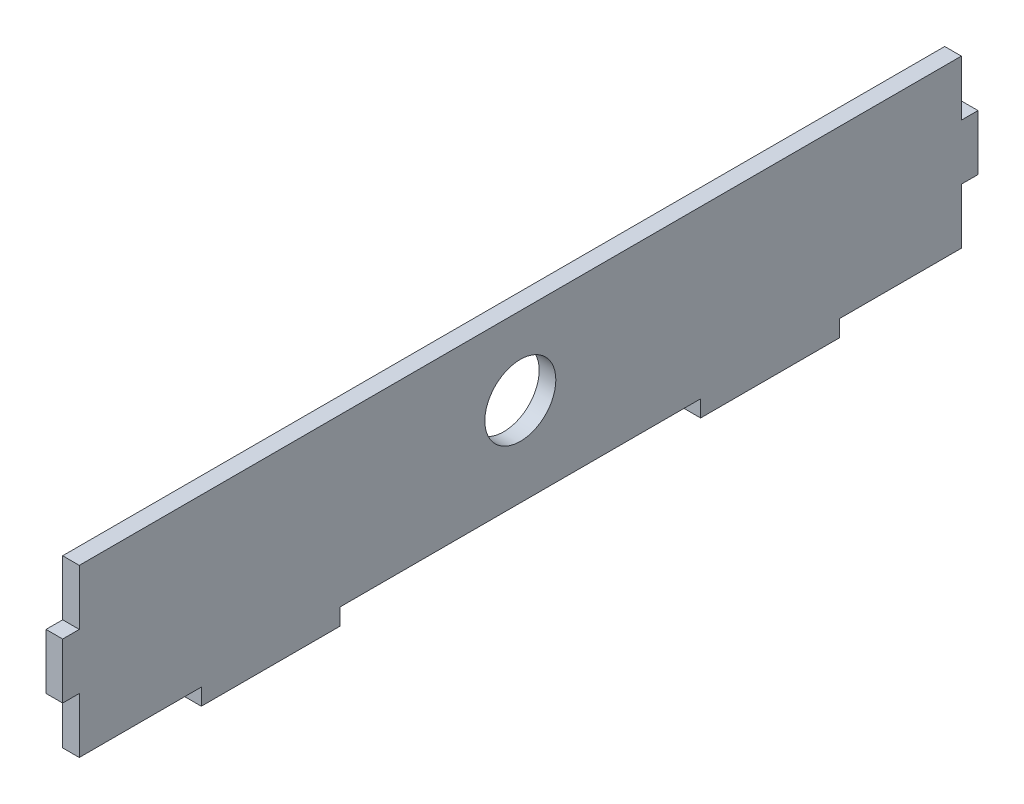
ISO-10303-21;
HEADER;
FILE_DESCRIPTION(('STEP AP214'),'2;1');
FILE_NAME('part.step','',(''),(''),'','','');
FILE_SCHEMA(('AUTOMOTIVE_DESIGN { 1 0 10303 214 1 1 1 1 }'));
ENDSEC;
DATA;
#1=APPLICATION_CONTEXT('core data for automotive mechanical design processes');
#2=APPLICATION_PROTOCOL_DEFINITION('international standard','automotive_design',2000,#1);
#3=PRODUCT_CONTEXT('',#1,'mechanical');
#4=PRODUCT('Part','Part','',(#3));
#5=PRODUCT_RELATED_PRODUCT_CATEGORY('part','',(#4));
#6=PRODUCT_DEFINITION_FORMATION('','',#4);
#7=PRODUCT_DEFINITION_CONTEXT('part definition',#1,'design');
#8=PRODUCT_DEFINITION('design','',#6,#7);
#9=PRODUCT_DEFINITION_SHAPE('','',#8);
#10=(LENGTH_UNIT() NAMED_UNIT(*) SI_UNIT(.MILLI.,.METRE.));
#11=(NAMED_UNIT(*) PLANE_ANGLE_UNIT() SI_UNIT($,.RADIAN.));
#12=(NAMED_UNIT(*) SI_UNIT($,.STERADIAN.) SOLID_ANGLE_UNIT());
#13=UNCERTAINTY_MEASURE_WITH_UNIT(LENGTH_MEASURE(1.E-05),#10,'distance_accuracy_value','');
#14=(GEOMETRIC_REPRESENTATION_CONTEXT(3) GLOBAL_UNCERTAINTY_ASSIGNED_CONTEXT((#13)) GLOBAL_UNIT_ASSIGNED_CONTEXT((#10,
#11,#12)) REPRESENTATION_CONTEXT('',''));
#15=CARTESIAN_POINT('',(0.,0.,0.));
#16=DIRECTION('',(0.,0.,1.));
#17=DIRECTION('',(1.,0.,0.));
#18=AXIS2_PLACEMENT_3D('',#15,#16,#17);
#19=CARTESIAN_POINT('',(3.,0.,0.));
#20=DIRECTION('',(1.,0.,0.));
#21=DIRECTION('',(0.,0.,-1.));
#22=AXIS2_PLACEMENT_3D('',#19,#20,#21);
#23=PLANE('',#22);
#24=DIRECTION('',(0.,-1.,0.));
#25=VECTOR('',#24,1.);
#26=CARTESIAN_POINT('',(3.,5.00000000000001,79.5));
#27=LINE('',#26,#25);
#28=CARTESIAN_POINT('',(3.,15.,79.5));
#29=VERTEX_POINT('',#28);
#30=CARTESIAN_POINT('',(3.,5.00000000000001,79.5));
#31=VERTEX_POINT('',#30);
#32=EDGE_CURVE('E241',#29,#31,#27,.T.);
#33=ORIENTED_EDGE('',*,*,#32,.T.);
#34=DIRECTION('',(0.,0.,1.));
#35=VECTOR('',#34,1.);
#36=CARTESIAN_POINT('',(3.,5.00000000000001,79.5));
#37=LINE('',#36,#35);
#38=CARTESIAN_POINT('',(3.,4.99999999999999,82.5));
#39=VERTEX_POINT('',#38);
#40=EDGE_CURVE('E129',#31,#39,#37,.T.);
#41=ORIENTED_EDGE('',*,*,#40,.T.);
#42=DIRECTION('',(0.,-1.,0.));
#43=VECTOR('',#42,1.);
#44=CARTESIAN_POINT('',(3.,4.99999999999999,82.5));
#45=LINE('',#44,#43);
#46=CARTESIAN_POINT('',(3.,-5.00000000000001,82.5));
#47=VERTEX_POINT('',#46);
#48=EDGE_CURVE('E292',#39,#47,#45,.T.);
#49=ORIENTED_EDGE('',*,*,#48,.T.);
#50=DIRECTION('',(0.,0.,-1.));
#51=VECTOR('',#50,1.);
#52=CARTESIAN_POINT('',(3.,-4.99999999999999,79.5));
#53=LINE('',#52,#51);
#54=CARTESIAN_POINT('',(3.,-4.99999999999999,79.5));
#55=VERTEX_POINT('',#54);
#56=EDGE_CURVE('E311',#47,#55,#53,.T.);
#57=ORIENTED_EDGE('',*,*,#56,.T.);
#58=DIRECTION('',(0.,-1.,0.));
#59=VECTOR('',#58,1.);
#60=CARTESIAN_POINT('',(3.,-15.,79.5));
#61=LINE('',#60,#59);
#62=CARTESIAN_POINT('',(3.,-15.,79.5));
#63=VERTEX_POINT('',#62);
#64=EDGE_CURVE('E308',#55,#63,#61,.T.);
#65=ORIENTED_EDGE('',*,*,#64,.T.);
#66=DIRECTION('',(0.,0.,-1.));
#67=VECTOR('',#66,1.);
#68=CARTESIAN_POINT('',(3.,-15.,57.5));
#69=LINE('',#68,#67);
#70=CARTESIAN_POINT('',(3.,-15.,57.5));
#71=VERTEX_POINT('',#70);
#72=EDGE_CURVE('E310',#63,#71,#69,.T.);
#73=ORIENTED_EDGE('',*,*,#72,.T.);
#74=DIRECTION('',(0.,-1.,0.));
#75=VECTOR('',#74,1.);
#76=CARTESIAN_POINT('',(3.,-15.,57.5));
#77=LINE('',#76,#75);
#78=CARTESIAN_POINT('',(3.,-18.,57.5));
#79=VERTEX_POINT('',#78);
#80=EDGE_CURVE('E313',#71,#79,#77,.T.);
#81=ORIENTED_EDGE('',*,*,#80,.T.);
#82=DIRECTION('',(0.,0.,-1.));
#83=VECTOR('',#82,1.);
#84=CARTESIAN_POINT('',(3.,-18.,57.5));
#85=LINE('',#84,#83);
#86=CARTESIAN_POINT('',(3.,-18.,32.5));
#87=VERTEX_POINT('',#86);
#88=EDGE_CURVE('E319',#79,#87,#85,.T.);
#89=ORIENTED_EDGE('',*,*,#88,.T.);
#90=DIRECTION('',(0.,1.,0.));
#91=VECTOR('',#90,1.);
#92=CARTESIAN_POINT('',(3.,-15.,32.5));
#93=LINE('',#92,#91);
#94=CARTESIAN_POINT('',(3.,-15.,32.5));
#95=VERTEX_POINT('',#94);
#96=EDGE_CURVE('E321',#87,#95,#93,.T.);
#97=ORIENTED_EDGE('',*,*,#96,.T.);
#98=DIRECTION('',(0.,0.,-1.));
#99=VECTOR('',#98,1.);
#100=CARTESIAN_POINT('',(3.,-15.,-32.5));
#101=LINE('',#100,#99);
#102=CARTESIAN_POINT('',(3.,-15.,-32.5));
#103=VERTEX_POINT('',#102);
#104=EDGE_CURVE('E323',#95,#103,#101,.T.);
#105=ORIENTED_EDGE('',*,*,#104,.T.);
#106=DIRECTION('',(0.,-1.,0.));
#107=VECTOR('',#106,1.);
#108=CARTESIAN_POINT('',(3.,-15.,-32.5));
#109=LINE('',#108,#107);
#110=CARTESIAN_POINT('',(3.,-18.,-32.5));
#111=VERTEX_POINT('',#110);
#112=EDGE_CURVE('E325',#103,#111,#109,.T.);
#113=ORIENTED_EDGE('',*,*,#112,.T.);
#114=DIRECTION('',(0.,0.,-1.));
#115=VECTOR('',#114,1.);
#116=CARTESIAN_POINT('',(3.,-18.,-32.5));
#117=LINE('',#116,#115);
#118=CARTESIAN_POINT('',(3.,-18.,-57.5));
#119=VERTEX_POINT('',#118);
#120=EDGE_CURVE('E327',#111,#119,#117,.T.);
#121=ORIENTED_EDGE('',*,*,#120,.T.);
#122=DIRECTION('',(0.,1.,0.));
#123=VECTOR('',#122,1.);
#124=CARTESIAN_POINT('',(3.,-15.,-57.5));
#125=LINE('',#124,#123);
#126=CARTESIAN_POINT('',(3.,-15.,-57.5));
#127=VERTEX_POINT('',#126);
#128=EDGE_CURVE('E329',#119,#127,#125,.T.);
#129=ORIENTED_EDGE('',*,*,#128,.T.);
#130=DIRECTION('',(0.,0.,-1.));
#131=VECTOR('',#130,1.);
#132=CARTESIAN_POINT('',(3.,-15.,-79.5));
#133=LINE('',#132,#131);
#134=CARTESIAN_POINT('',(3.,-15.,-79.5));
#135=VERTEX_POINT('',#134);
#136=EDGE_CURVE('E331',#127,#135,#133,.T.);
#137=ORIENTED_EDGE('',*,*,#136,.T.);
#138=DIRECTION('',(0.,1.,0.));
#139=VECTOR('',#138,1.);
#140=CARTESIAN_POINT('',(3.,-15.,-79.5));
#141=LINE('',#140,#139);
#142=CARTESIAN_POINT('',(3.,-4.99999999999999,-79.5));
#143=VERTEX_POINT('',#142);
#144=EDGE_CURVE('E333',#135,#143,#141,.T.);
#145=ORIENTED_EDGE('',*,*,#144,.T.);
#146=DIRECTION('',(0.,0.,-1.));
#147=VECTOR('',#146,1.);
#148=CARTESIAN_POINT('',(3.,-4.99999999999999,-79.5));
#149=LINE('',#148,#147);
#150=CARTESIAN_POINT('',(3.,-4.99999999999999,-82.5));
#151=VERTEX_POINT('',#150);
#152=EDGE_CURVE('E335',#143,#151,#149,.T.);
#153=ORIENTED_EDGE('',*,*,#152,.T.);
#154=DIRECTION('',(0.,1.,0.));
#155=VECTOR('',#154,1.);
#156=CARTESIAN_POINT('',(3.,5.00000000000001,-82.5));
#157=LINE('',#156,#155);
#158=CARTESIAN_POINT('',(3.,5.00000000000001,-82.5));
#159=VERTEX_POINT('',#158);
#160=EDGE_CURVE('E184',#151,#159,#157,.T.);
#161=ORIENTED_EDGE('',*,*,#160,.T.);
#162=DIRECTION('',(0.,0.,1.));
#163=VECTOR('',#162,1.);
#164=CARTESIAN_POINT('',(3.,5.00000000000001,-79.5));
#165=LINE('',#164,#163);
#166=CARTESIAN_POINT('',(3.,5.00000000000001,-79.5));
#167=VERTEX_POINT('',#166);
#168=EDGE_CURVE('E178',#159,#167,#165,.T.);
#169=ORIENTED_EDGE('',*,*,#168,.T.);
#170=DIRECTION('',(0.,1.,0.));
#171=VECTOR('',#170,1.);
#172=CARTESIAN_POINT('',(3.,5.00000000000001,-79.5));
#173=LINE('',#172,#171);
#174=CARTESIAN_POINT('',(3.,15.,-79.5));
#175=VERTEX_POINT('',#174);
#176=EDGE_CURVE('E182',#167,#175,#173,.T.);
#177=ORIENTED_EDGE('',*,*,#176,.T.);
#178=DIRECTION('',(0.,0.,1.));
#179=VECTOR('',#178,1.);
#180=CARTESIAN_POINT('',(3.,15.,-79.5));
#181=LINE('',#180,#179);
#182=EDGE_CURVE('E50',#175,#29,#181,.T.);
#183=ORIENTED_EDGE('',*,*,#182,.T.);
#184=EDGE_LOOP('',(#33,#41,#49,#57,#65,#73,#81,#89,#97,#105,#113,#121,#129,#137,#145,#153,#161,
#169,#177,#183));
#185=FACE_BOUND('',#184,.T.);
#186=CARTESIAN_POINT('',(3.,0.999999999999998,0.));
#187=DIRECTION('',(1.,0.,0.));
#188=DIRECTION('',(0.,0.,-1.));
#189=AXIS2_PLACEMENT_3D('',#186,#187,#188);
#190=CIRCLE('',#189,6.4);
#191=CARTESIAN_POINT('',(3.,0.999999999999998,-6.4));
#192=VERTEX_POINT('',#191);
#193=EDGE_CURVE('E206',#192,#192,#190,.T.);
#194=ORIENTED_EDGE('',*,*,#193,.F.);
#195=EDGE_LOOP('',(#194));
#196=FACE_BOUND('',#195,.T.);
#197=ADVANCED_FACE('F33',(#185,#196),#23,.T.);
#198=CARTESIAN_POINT('',(0.,0.,0.));
#199=DIRECTION('',(1.,0.,0.));
#200=DIRECTION('',(0.,0.,-1.));
#201=AXIS2_PLACEMENT_3D('',#198,#199,#200);
#202=PLANE('',#201);
#203=DIRECTION('',(0.,-1.,0.));
#204=VECTOR('',#203,1.);
#205=CARTESIAN_POINT('',(0.,5.00000000000001,79.5));
#206=LINE('',#205,#204);
#207=CARTESIAN_POINT('',(0.,15.,79.5));
#208=VERTEX_POINT('',#207);
#209=CARTESIAN_POINT('',(0.,5.00000000000001,79.5));
#210=VERTEX_POINT('',#209);
#211=EDGE_CURVE('E202',#208,#210,#206,.T.);
#212=ORIENTED_EDGE('',*,*,#211,.F.);
#213=DIRECTION('',(0.,0.,1.));
#214=VECTOR('',#213,1.);
#215=CARTESIAN_POINT('',(0.,15.,-79.5));
#216=LINE('',#215,#214);
#217=CARTESIAN_POINT('',(0.,15.,-79.5));
#218=VERTEX_POINT('',#217);
#219=EDGE_CURVE('E121',#218,#208,#216,.T.);
#220=ORIENTED_EDGE('',*,*,#219,.F.);
#221=DIRECTION('',(0.,1.,0.));
#222=VECTOR('',#221,1.);
#223=CARTESIAN_POINT('',(0.,5.00000000000001,-79.5));
#224=LINE('',#223,#222);
#225=CARTESIAN_POINT('',(0.,5.00000000000001,-79.5));
#226=VERTEX_POINT('',#225);
#227=EDGE_CURVE('E115',#226,#218,#224,.T.);
#228=ORIENTED_EDGE('',*,*,#227,.F.);
#229=DIRECTION('',(0.,0.,1.));
#230=VECTOR('',#229,1.);
#231=CARTESIAN_POINT('',(0.,5.00000000000001,-79.5));
#232=LINE('',#231,#230);
#233=CARTESIAN_POINT('',(0.,5.00000000000001,-82.5));
#234=VERTEX_POINT('',#233);
#235=EDGE_CURVE('E192',#234,#226,#232,.T.);
#236=ORIENTED_EDGE('',*,*,#235,.F.);
#237=DIRECTION('',(0.,1.,0.));
#238=VECTOR('',#237,1.);
#239=CARTESIAN_POINT('',(0.,5.00000000000001,-82.5));
#240=LINE('',#239,#238);
#241=CARTESIAN_POINT('',(0.,-4.99999999999999,-82.5));
#242=VERTEX_POINT('',#241);
#243=EDGE_CURVE('E236',#242,#234,#240,.T.);
#244=ORIENTED_EDGE('',*,*,#243,.F.);
#245=DIRECTION('',(0.,0.,-1.));
#246=VECTOR('',#245,1.);
#247=CARTESIAN_POINT('',(0.,-4.99999999999999,-79.5));
#248=LINE('',#247,#246);
#249=CARTESIAN_POINT('',(0.,-4.99999999999999,-79.5));
#250=VERTEX_POINT('',#249);
#251=EDGE_CURVE('E234',#250,#242,#248,.T.);
#252=ORIENTED_EDGE('',*,*,#251,.F.);
#253=DIRECTION('',(0.,1.,0.));
#254=VECTOR('',#253,1.);
#255=CARTESIAN_POINT('',(0.,-15.,-79.5));
#256=LINE('',#255,#254);
#257=CARTESIAN_POINT('',(0.,-15.,-79.5));
#258=VERTEX_POINT('',#257);
#259=EDGE_CURVE('E232',#258,#250,#256,.T.);
#260=ORIENTED_EDGE('',*,*,#259,.F.);
#261=DIRECTION('',(0.,0.,-1.));
#262=VECTOR('',#261,1.);
#263=CARTESIAN_POINT('',(0.,-15.,-79.5));
#264=LINE('',#263,#262);
#265=CARTESIAN_POINT('',(0.,-15.,-57.5));
#266=VERTEX_POINT('',#265);
#267=EDGE_CURVE('E230',#266,#258,#264,.T.);
#268=ORIENTED_EDGE('',*,*,#267,.F.);
#269=DIRECTION('',(0.,1.,0.));
#270=VECTOR('',#269,1.);
#271=CARTESIAN_POINT('',(0.,-15.,-57.5));
#272=LINE('',#271,#270);
#273=CARTESIAN_POINT('',(0.,-18.,-57.5));
#274=VERTEX_POINT('',#273);
#275=EDGE_CURVE('E228',#274,#266,#272,.T.);
#276=ORIENTED_EDGE('',*,*,#275,.F.);
#277=DIRECTION('',(0.,0.,-1.));
#278=VECTOR('',#277,1.);
#279=CARTESIAN_POINT('',(0.,-18.,-32.5));
#280=LINE('',#279,#278);
#281=CARTESIAN_POINT('',(0.,-18.,-32.5));
#282=VERTEX_POINT('',#281);
#283=EDGE_CURVE('E226',#282,#274,#280,.T.);
#284=ORIENTED_EDGE('',*,*,#283,.F.);
#285=DIRECTION('',(0.,-1.,0.));
#286=VECTOR('',#285,1.);
#287=CARTESIAN_POINT('',(0.,-15.,-32.5));
#288=LINE('',#287,#286);
#289=CARTESIAN_POINT('',(0.,-15.,-32.5));
#290=VERTEX_POINT('',#289);
#291=EDGE_CURVE('E224',#290,#282,#288,.T.);
#292=ORIENTED_EDGE('',*,*,#291,.F.);
#293=DIRECTION('',(0.,0.,-1.));
#294=VECTOR('',#293,1.);
#295=CARTESIAN_POINT('',(0.,-15.,-32.5));
#296=LINE('',#295,#294);
#297=CARTESIAN_POINT('',(0.,-15.,32.5));
#298=VERTEX_POINT('',#297);
#299=EDGE_CURVE('E222',#298,#290,#296,.T.);
#300=ORIENTED_EDGE('',*,*,#299,.F.);
#301=DIRECTION('',(0.,1.,0.));
#302=VECTOR('',#301,1.);
#303=CARTESIAN_POINT('',(0.,-15.,32.5));
#304=LINE('',#303,#302);
#305=CARTESIAN_POINT('',(0.,-18.,32.5));
#306=VERTEX_POINT('',#305);
#307=EDGE_CURVE('E220',#306,#298,#304,.T.);
#308=ORIENTED_EDGE('',*,*,#307,.F.);
#309=DIRECTION('',(0.,0.,-1.));
#310=VECTOR('',#309,1.);
#311=CARTESIAN_POINT('',(0.,-18.,57.5));
#312=LINE('',#311,#310);
#313=CARTESIAN_POINT('',(0.,-18.,57.5));
#314=VERTEX_POINT('',#313);
#315=EDGE_CURVE('E218',#314,#306,#312,.T.);
#316=ORIENTED_EDGE('',*,*,#315,.F.);
#317=DIRECTION('',(0.,-1.,0.));
#318=VECTOR('',#317,1.);
#319=CARTESIAN_POINT('',(0.,-15.,57.5));
#320=LINE('',#319,#318);
#321=CARTESIAN_POINT('',(0.,-15.,57.5));
#322=VERTEX_POINT('',#321);
#323=EDGE_CURVE('E216',#322,#314,#320,.T.);
#324=ORIENTED_EDGE('',*,*,#323,.F.);
#325=DIRECTION('',(0.,0.,-1.));
#326=VECTOR('',#325,1.);
#327=CARTESIAN_POINT('',(0.,-15.,57.5));
#328=LINE('',#327,#326);
#329=CARTESIAN_POINT('',(0.,-15.,79.5));
#330=VERTEX_POINT('',#329);
#331=EDGE_CURVE('E214',#330,#322,#328,.T.);
#332=ORIENTED_EDGE('',*,*,#331,.F.);
#333=DIRECTION('',(0.,-1.,0.));
#334=VECTOR('',#333,1.);
#335=CARTESIAN_POINT('',(0.,-15.,79.5));
#336=LINE('',#335,#334);
#337=CARTESIAN_POINT('',(0.,-4.99999999999999,79.5));
#338=VERTEX_POINT('',#337);
#339=EDGE_CURVE('E212',#338,#330,#336,.T.);
#340=ORIENTED_EDGE('',*,*,#339,.F.);
#341=DIRECTION('',(0.,0.,-1.));
#342=VECTOR('',#341,1.);
#343=CARTESIAN_POINT('',(0.,-4.99999999999999,79.5));
#344=LINE('',#343,#342);
#345=CARTESIAN_POINT('',(0.,-5.00000000000001,82.5));
#346=VERTEX_POINT('',#345);
#347=EDGE_CURVE('E210',#346,#338,#344,.T.);
#348=ORIENTED_EDGE('',*,*,#347,.F.);
#349=DIRECTION('',(0.,-1.,0.));
#350=VECTOR('',#349,1.);
#351=CARTESIAN_POINT('',(0.,4.99999999999999,82.5));
#352=LINE('',#351,#350);
#353=CARTESIAN_POINT('',(0.,4.99999999999999,82.5));
#354=VERTEX_POINT('',#353);
#355=EDGE_CURVE('E208',#354,#346,#352,.T.);
#356=ORIENTED_EDGE('',*,*,#355,.F.);
#357=DIRECTION('',(0.,0.,1.));
#358=VECTOR('',#357,1.);
#359=CARTESIAN_POINT('',(0.,5.00000000000001,79.5));
#360=LINE('',#359,#358);
#361=EDGE_CURVE('E205',#210,#354,#360,.T.);
#362=ORIENTED_EDGE('',*,*,#361,.F.);
#363=EDGE_LOOP('',(#212,#220,#228,#236,#244,#252,#260,#268,#276,#284,#292,#300,#308,#316,#324,
#332,#340,#348,#356,#362));
#364=FACE_BOUND('',#363,.T.);
#365=CARTESIAN_POINT('',(0.,0.999999999999998,0.));
#366=DIRECTION('',(1.,0.,0.));
#367=DIRECTION('',(0.,0.,-1.));
#368=AXIS2_PLACEMENT_3D('',#365,#366,#367);
#369=CIRCLE('',#368,6.4);
#370=CARTESIAN_POINT('',(0.,0.999999999999998,-6.4));
#371=VERTEX_POINT('',#370);
#372=EDGE_CURVE('E586',#371,#371,#369,.T.);
#373=ORIENTED_EDGE('',*,*,#372,.T.);
#374=EDGE_LOOP('',(#373));
#375=FACE_BOUND('',#374,.T.);
#376=ADVANCED_FACE('F296',(#364,#375),#202,.F.);
#377=CARTESIAN_POINT('',(3.,5.00000000000001,79.5));
#378=DIRECTION('',(0.,0.,-1.));
#379=DIRECTION('',(-1.,0.,0.));
#380=AXIS2_PLACEMENT_3D('',#377,#378,#379);
#381=PLANE('',#380);
#382=ORIENTED_EDGE('',*,*,#211,.T.);
#383=DIRECTION('',(-1.,0.,0.));
#384=VECTOR('',#383,1.);
#385=CARTESIAN_POINT('',(3.,5.00000000000001,79.5));
#386=LINE('',#385,#384);
#387=EDGE_CURVE('E11',#31,#210,#386,.T.);
#388=ORIENTED_EDGE('',*,*,#387,.F.);
#389=ORIENTED_EDGE('',*,*,#32,.F.);
#390=DIRECTION('',(-1.,0.,0.));
#391=VECTOR('',#390,1.);
#392=CARTESIAN_POINT('',(3.,15.,79.5));
#393=LINE('',#392,#391);
#394=EDGE_CURVE('E198',#29,#208,#393,.T.);
#395=ORIENTED_EDGE('',*,*,#394,.T.);
#396=EDGE_LOOP('',(#382,#388,#389,#395));
#397=FACE_BOUND('',#396,.T.);
#398=ADVANCED_FACE('F35',(#397),#381,.F.);
#399=CARTESIAN_POINT('',(3.,5.00000000000001,79.5));
#400=DIRECTION('',(0.,-1.,0.));
#401=DIRECTION('',(0.,0.,-1.));
#402=AXIS2_PLACEMENT_3D('',#399,#400,#401);
#403=PLANE('',#402);
#404=ORIENTED_EDGE('',*,*,#361,.T.);
#405=DIRECTION('',(-1.,0.,0.));
#406=VECTOR('',#405,1.);
#407=CARTESIAN_POINT('',(3.,4.99999999999999,82.5));
#408=LINE('',#407,#406);
#409=EDGE_CURVE('E42',#39,#354,#408,.T.);
#410=ORIENTED_EDGE('',*,*,#409,.F.);
#411=ORIENTED_EDGE('',*,*,#40,.F.);
#412=ORIENTED_EDGE('',*,*,#387,.T.);
#413=EDGE_LOOP('',(#404,#410,#411,#412));
#414=FACE_BOUND('',#413,.T.);
#415=ADVANCED_FACE('F369',(#414),#403,.F.);
#416=CARTESIAN_POINT('',(3.,4.99999999999999,82.5));
#417=DIRECTION('',(0.,0.,-1.));
#418=DIRECTION('',(-1.,0.,0.));
#419=AXIS2_PLACEMENT_3D('',#416,#417,#418);
#420=PLANE('',#419);
#421=ORIENTED_EDGE('',*,*,#355,.T.);
#422=DIRECTION('',(-1.,0.,0.));
#423=VECTOR('',#422,1.);
#424=CARTESIAN_POINT('',(3.,-5.00000000000001,82.5));
#425=LINE('',#424,#423);
#426=EDGE_CURVE('E284',#47,#346,#425,.T.);
#427=ORIENTED_EDGE('',*,*,#426,.F.);
#428=ORIENTED_EDGE('',*,*,#48,.F.);
#429=ORIENTED_EDGE('',*,*,#409,.T.);
#430=EDGE_LOOP('',(#421,#427,#428,#429));
#431=FACE_BOUND('',#430,.T.);
#432=ADVANCED_FACE('F290',(#431),#420,.F.);
#433=CARTESIAN_POINT('',(3.,-4.99999999999999,79.5));
#434=DIRECTION('',(0.,1.,0.));
#435=DIRECTION('',(0.,0.,1.));
#436=AXIS2_PLACEMENT_3D('',#433,#434,#435);
#437=PLANE('',#436);
#438=ORIENTED_EDGE('',*,*,#347,.T.);
#439=DIRECTION('',(-1.,0.,0.));
#440=VECTOR('',#439,1.);
#441=CARTESIAN_POINT('',(3.,-4.99999999999999,79.5));
#442=LINE('',#441,#440);
#443=EDGE_CURVE('E281',#55,#338,#442,.T.);
#444=ORIENTED_EDGE('',*,*,#443,.F.);
#445=ORIENTED_EDGE('',*,*,#56,.F.);
#446=ORIENTED_EDGE('',*,*,#426,.T.);
#447=EDGE_LOOP('',(#438,#444,#445,#446));
#448=FACE_BOUND('',#447,.T.);
#449=ADVANCED_FACE('F302',(#448),#437,.F.);
#450=CARTESIAN_POINT('',(3.,-15.,79.5));
#451=DIRECTION('',(0.,0.,-1.));
#452=DIRECTION('',(-1.,0.,0.));
#453=AXIS2_PLACEMENT_3D('',#450,#451,#452);
#454=PLANE('',#453);
#455=ORIENTED_EDGE('',*,*,#339,.T.);
#456=DIRECTION('',(-1.,0.,0.));
#457=VECTOR('',#456,1.);
#458=CARTESIAN_POINT('',(3.,-15.,79.5));
#459=LINE('',#458,#457);
#460=EDGE_CURVE('E278',#63,#330,#459,.T.);
#461=ORIENTED_EDGE('',*,*,#460,.F.);
#462=ORIENTED_EDGE('',*,*,#64,.F.);
#463=ORIENTED_EDGE('',*,*,#443,.T.);
#464=EDGE_LOOP('',(#455,#461,#462,#463));
#465=FACE_BOUND('',#464,.T.);
#466=ADVANCED_FACE('F306',(#465),#454,.F.);
#467=CARTESIAN_POINT('',(3.,-15.,57.5));
#468=DIRECTION('',(0.,1.,0.));
#469=DIRECTION('',(0.,0.,1.));
#470=AXIS2_PLACEMENT_3D('',#467,#468,#469);
#471=PLANE('',#470);
#472=ORIENTED_EDGE('',*,*,#331,.T.);
#473=DIRECTION('',(-1.,0.,0.));
#474=VECTOR('',#473,1.);
#475=CARTESIAN_POINT('',(3.,-15.,57.5));
#476=LINE('',#475,#474);
#477=EDGE_CURVE('E275',#71,#322,#476,.T.);
#478=ORIENTED_EDGE('',*,*,#477,.F.);
#479=ORIENTED_EDGE('',*,*,#72,.F.);
#480=ORIENTED_EDGE('',*,*,#460,.T.);
#481=EDGE_LOOP('',(#472,#478,#479,#480));
#482=FACE_BOUND('',#481,.T.);
#483=ADVANCED_FACE('F382',(#482),#471,.F.);
#484=CARTESIAN_POINT('',(3.,-15.,57.5));
#485=DIRECTION('',(0.,0.,-1.));
#486=DIRECTION('',(-1.,0.,0.));
#487=AXIS2_PLACEMENT_3D('',#484,#485,#486);
#488=PLANE('',#487);
#489=ORIENTED_EDGE('',*,*,#323,.T.);
#490=DIRECTION('',(-1.,0.,0.));
#491=VECTOR('',#490,1.);
#492=CARTESIAN_POINT('',(3.,-18.,57.5));
#493=LINE('',#492,#491);
#494=EDGE_CURVE('E272',#79,#314,#493,.T.);
#495=ORIENTED_EDGE('',*,*,#494,.F.);
#496=ORIENTED_EDGE('',*,*,#80,.F.);
#497=ORIENTED_EDGE('',*,*,#477,.T.);
#498=EDGE_LOOP('',(#489,#495,#496,#497));
#499=FACE_BOUND('',#498,.T.);
#500=ADVANCED_FACE('F385',(#499),#488,.F.);
#501=CARTESIAN_POINT('',(3.,-18.,57.5));
#502=DIRECTION('',(0.,1.,0.));
#503=DIRECTION('',(0.,0.,1.));
#504=AXIS2_PLACEMENT_3D('',#501,#502,#503);
#505=PLANE('',#504);
#506=ORIENTED_EDGE('',*,*,#315,.T.);
#507=DIRECTION('',(-1.,0.,0.));
#508=VECTOR('',#507,1.);
#509=CARTESIAN_POINT('',(3.,-18.,32.5));
#510=LINE('',#509,#508);
#511=EDGE_CURVE('E269',#87,#306,#510,.T.);
#512=ORIENTED_EDGE('',*,*,#511,.F.);
#513=ORIENTED_EDGE('',*,*,#88,.F.);
#514=ORIENTED_EDGE('',*,*,#494,.T.);
#515=EDGE_LOOP('',(#506,#512,#513,#514));
#516=FACE_BOUND('',#515,.T.);
#517=ADVANCED_FACE('F389',(#516),#505,.F.);
#518=CARTESIAN_POINT('',(3.,-15.,32.5));
#519=DIRECTION('',(0.,0.,1.));
#520=DIRECTION('',(1.,0.,0.));
#521=AXIS2_PLACEMENT_3D('',#518,#519,#520);
#522=PLANE('',#521);
#523=ORIENTED_EDGE('',*,*,#307,.T.);
#524=DIRECTION('',(-1.,0.,0.));
#525=VECTOR('',#524,1.);
#526=CARTESIAN_POINT('',(3.,-15.,32.5));
#527=LINE('',#526,#525);
#528=EDGE_CURVE('E266',#95,#298,#527,.T.);
#529=ORIENTED_EDGE('',*,*,#528,.F.);
#530=ORIENTED_EDGE('',*,*,#96,.F.);
#531=ORIENTED_EDGE('',*,*,#511,.T.);
#532=EDGE_LOOP('',(#523,#529,#530,#531));
#533=FACE_BOUND('',#532,.T.);
#534=ADVANCED_FACE('F393',(#533),#522,.F.);
#535=CARTESIAN_POINT('',(3.,-15.,-32.5));
#536=DIRECTION('',(0.,1.,0.));
#537=DIRECTION('',(0.,0.,1.));
#538=AXIS2_PLACEMENT_3D('',#535,#536,#537);
#539=PLANE('',#538);
#540=ORIENTED_EDGE('',*,*,#299,.T.);
#541=DIRECTION('',(-1.,0.,0.));
#542=VECTOR('',#541,1.);
#543=CARTESIAN_POINT('',(3.,-15.,-32.5));
#544=LINE('',#543,#542);
#545=EDGE_CURVE('E263',#103,#290,#544,.T.);
#546=ORIENTED_EDGE('',*,*,#545,.F.);
#547=ORIENTED_EDGE('',*,*,#104,.F.);
#548=ORIENTED_EDGE('',*,*,#528,.T.);
#549=EDGE_LOOP('',(#540,#546,#547,#548));
#550=FACE_BOUND('',#549,.T.);
#551=ADVANCED_FACE('F397',(#550),#539,.F.);
#552=CARTESIAN_POINT('',(3.,-15.,-32.5));
#553=DIRECTION('',(0.,0.,-1.));
#554=DIRECTION('',(-1.,0.,0.));
#555=AXIS2_PLACEMENT_3D('',#552,#553,#554);
#556=PLANE('',#555);
#557=ORIENTED_EDGE('',*,*,#291,.T.);
#558=DIRECTION('',(-1.,0.,0.));
#559=VECTOR('',#558,1.);
#560=CARTESIAN_POINT('',(3.,-18.,-32.5));
#561=LINE('',#560,#559);
#562=EDGE_CURVE('E260',#111,#282,#561,.T.);
#563=ORIENTED_EDGE('',*,*,#562,.F.);
#564=ORIENTED_EDGE('',*,*,#112,.F.);
#565=ORIENTED_EDGE('',*,*,#545,.T.);
#566=EDGE_LOOP('',(#557,#563,#564,#565));
#567=FACE_BOUND('',#566,.T.);
#568=ADVANCED_FACE('F401',(#567),#556,.F.);
#569=CARTESIAN_POINT('',(3.,-18.,-32.5));
#570=DIRECTION('',(0.,1.,0.));
#571=DIRECTION('',(0.,0.,1.));
#572=AXIS2_PLACEMENT_3D('',#569,#570,#571);
#573=PLANE('',#572);
#574=ORIENTED_EDGE('',*,*,#283,.T.);
#575=DIRECTION('',(-1.,0.,0.));
#576=VECTOR('',#575,1.);
#577=CARTESIAN_POINT('',(3.,-18.,-57.5));
#578=LINE('',#577,#576);
#579=EDGE_CURVE('E257',#119,#274,#578,.T.);
#580=ORIENTED_EDGE('',*,*,#579,.F.);
#581=ORIENTED_EDGE('',*,*,#120,.F.);
#582=ORIENTED_EDGE('',*,*,#562,.T.);
#583=EDGE_LOOP('',(#574,#580,#581,#582));
#584=FACE_BOUND('',#583,.T.);
#585=ADVANCED_FACE('F405',(#584),#573,.F.);
#586=CARTESIAN_POINT('',(3.,-15.,-57.5));
#587=DIRECTION('',(0.,0.,1.));
#588=DIRECTION('',(0.,-1.,0.));
#589=AXIS2_PLACEMENT_3D('',#586,#587,#588);
#590=PLANE('',#589);
#591=ORIENTED_EDGE('',*,*,#275,.T.);
#592=DIRECTION('',(-1.,0.,0.));
#593=VECTOR('',#592,1.);
#594=CARTESIAN_POINT('',(3.,-15.,-57.5));
#595=LINE('',#594,#593);
#596=EDGE_CURVE('E254',#127,#266,#595,.T.);
#597=ORIENTED_EDGE('',*,*,#596,.F.);
#598=ORIENTED_EDGE('',*,*,#128,.F.);
#599=ORIENTED_EDGE('',*,*,#579,.T.);
#600=EDGE_LOOP('',(#591,#597,#598,#599));
#601=FACE_BOUND('',#600,.T.);
#602=ADVANCED_FACE('F409',(#601),#590,.F.);
#603=CARTESIAN_POINT('',(3.,-15.,-79.5));
#604=DIRECTION('',(0.,1.,0.));
#605=DIRECTION('',(0.,0.,1.));
#606=AXIS2_PLACEMENT_3D('',#603,#604,#605);
#607=PLANE('',#606);
#608=ORIENTED_EDGE('',*,*,#267,.T.);
#609=DIRECTION('',(-1.,0.,0.));
#610=VECTOR('',#609,1.);
#611=CARTESIAN_POINT('',(3.,-15.,-79.5));
#612=LINE('',#611,#610);
#613=EDGE_CURVE('E251',#135,#258,#612,.T.);
#614=ORIENTED_EDGE('',*,*,#613,.F.);
#615=ORIENTED_EDGE('',*,*,#136,.F.);
#616=ORIENTED_EDGE('',*,*,#596,.T.);
#617=EDGE_LOOP('',(#608,#614,#615,#616));
#618=FACE_BOUND('',#617,.T.);
#619=ADVANCED_FACE('F413',(#618),#607,.F.);
#620=CARTESIAN_POINT('',(3.,-15.,-79.5));
#621=DIRECTION('',(0.,0.,1.));
#622=DIRECTION('',(1.,0.,0.));
#623=AXIS2_PLACEMENT_3D('',#620,#621,#622);
#624=PLANE('',#623);
#625=ORIENTED_EDGE('',*,*,#259,.T.);
#626=DIRECTION('',(-1.,0.,0.));
#627=VECTOR('',#626,1.);
#628=CARTESIAN_POINT('',(3.,-4.99999999999999,-79.5));
#629=LINE('',#628,#627);
#630=EDGE_CURVE('E248',#143,#250,#629,.T.);
#631=ORIENTED_EDGE('',*,*,#630,.F.);
#632=ORIENTED_EDGE('',*,*,#144,.F.);
#633=ORIENTED_EDGE('',*,*,#613,.T.);
#634=EDGE_LOOP('',(#625,#631,#632,#633));
#635=FACE_BOUND('',#634,.T.);
#636=ADVANCED_FACE('F417',(#635),#624,.F.);
#637=CARTESIAN_POINT('',(3.,-4.99999999999999,-79.5));
#638=DIRECTION('',(0.,1.,0.));
#639=DIRECTION('',(0.,0.,1.));
#640=AXIS2_PLACEMENT_3D('',#637,#638,#639);
#641=PLANE('',#640);
#642=ORIENTED_EDGE('',*,*,#251,.T.);
#643=DIRECTION('',(-1.,0.,0.));
#644=VECTOR('',#643,1.);
#645=CARTESIAN_POINT('',(3.,-4.99999999999999,-82.5));
#646=LINE('',#645,#644);
#647=EDGE_CURVE('E245',#151,#242,#646,.T.);
#648=ORIENTED_EDGE('',*,*,#647,.F.);
#649=ORIENTED_EDGE('',*,*,#152,.F.);
#650=ORIENTED_EDGE('',*,*,#630,.T.);
#651=EDGE_LOOP('',(#642,#648,#649,#650));
#652=FACE_BOUND('',#651,.T.);
#653=ADVANCED_FACE('F341',(#652),#641,.F.);
#654=CARTESIAN_POINT('',(3.,5.00000000000001,-82.5));
#655=DIRECTION('',(0.,0.,1.));
#656=DIRECTION('',(1.,0.,0.));
#657=AXIS2_PLACEMENT_3D('',#654,#655,#656);
#658=PLANE('',#657);
#659=ORIENTED_EDGE('',*,*,#243,.T.);
#660=DIRECTION('',(-1.,0.,0.));
#661=VECTOR('',#660,1.);
#662=CARTESIAN_POINT('',(3.,5.00000000000001,-82.5));
#663=LINE('',#662,#661);
#664=EDGE_CURVE('E193',#159,#234,#663,.T.);
#665=ORIENTED_EDGE('',*,*,#664,.F.);
#666=ORIENTED_EDGE('',*,*,#160,.F.);
#667=ORIENTED_EDGE('',*,*,#647,.T.);
#668=EDGE_LOOP('',(#659,#665,#666,#667));
#669=FACE_BOUND('',#668,.T.);
#670=ADVANCED_FACE('F345',(#669),#658,.F.);
#671=CARTESIAN_POINT('',(3.,5.00000000000001,-79.5));
#672=DIRECTION('',(0.,-1.,0.));
#673=DIRECTION('',(0.,0.,-1.));
#674=AXIS2_PLACEMENT_3D('',#671,#672,#673);
#675=PLANE('',#674);
#676=ORIENTED_EDGE('',*,*,#235,.T.);
#677=DIRECTION('',(-1.,0.,0.));
#678=VECTOR('',#677,1.);
#679=CARTESIAN_POINT('',(3.,5.00000000000001,-79.5));
#680=LINE('',#679,#678);
#681=EDGE_CURVE('E189',#167,#226,#680,.T.);
#682=ORIENTED_EDGE('',*,*,#681,.F.);
#683=ORIENTED_EDGE('',*,*,#168,.F.);
#684=ORIENTED_EDGE('',*,*,#664,.T.);
#685=EDGE_LOOP('',(#676,#682,#683,#684));
#686=FACE_BOUND('',#685,.T.);
#687=ADVANCED_FACE('F190',(#686),#675,.F.);
#688=CARTESIAN_POINT('',(3.,5.00000000000001,-79.5));
#689=DIRECTION('',(0.,0.,1.));
#690=DIRECTION('',(1.,0.,0.));
#691=AXIS2_PLACEMENT_3D('',#688,#689,#690);
#692=PLANE('',#691);
#693=ORIENTED_EDGE('',*,*,#227,.T.);
#694=DIRECTION('',(-1.,0.,0.));
#695=VECTOR('',#694,1.);
#696=CARTESIAN_POINT('',(3.,15.,-79.5));
#697=LINE('',#696,#695);
#698=EDGE_CURVE('E194',#175,#218,#697,.T.);
#699=ORIENTED_EDGE('',*,*,#698,.F.);
#700=ORIENTED_EDGE('',*,*,#176,.F.);
#701=ORIENTED_EDGE('',*,*,#681,.T.);
#702=EDGE_LOOP('',(#693,#699,#700,#701));
#703=FACE_BOUND('',#702,.T.);
#704=ADVANCED_FACE('F196',(#703),#692,.F.);
#705=CARTESIAN_POINT('',(3.,15.,-79.5));
#706=DIRECTION('',(0.,-1.,0.));
#707=DIRECTION('',(0.,0.,-1.));
#708=AXIS2_PLACEMENT_3D('',#705,#706,#707);
#709=PLANE('',#708);
#710=ORIENTED_EDGE('',*,*,#219,.T.);
#711=ORIENTED_EDGE('',*,*,#394,.F.);
#712=ORIENTED_EDGE('',*,*,#182,.F.);
#713=ORIENTED_EDGE('',*,*,#698,.T.);
#714=EDGE_LOOP('',(#710,#711,#712,#713));
#715=FACE_BOUND('',#714,.T.);
#716=ADVANCED_FACE('F349',(#715),#709,.F.);
#717=CARTESIAN_POINT('',(3.,0.999999999999998,0.));
#718=DIRECTION('',(-1.,0.,0.));
#719=DIRECTION('',(0.,0.,1.));
#720=AXIS2_PLACEMENT_3D('',#717,#718,#719);
#721=CYLINDRICAL_SURFACE('',#720,6.4);
#722=ORIENTED_EDGE('',*,*,#193,.T.);
#723=EDGE_LOOP('',(#722));
#724=FACE_BOUND('',#723,.T.);
#725=ORIENTED_EDGE('',*,*,#372,.F.);
#726=EDGE_LOOP('',(#725));
#727=FACE_BOUND('',#726,.T.);
#728=ADVANCED_FACE('F351',(#724,#727),#721,.F.);
#729=CLOSED_SHELL('',(#197,#376,#398,#415,#432,#449,#466,#483,#500,#517,#534,#551,#568,#585,
#602,#619,#636,#653,#670,#687,#704,#716,#728));
#730=MANIFOLD_SOLID_BREP('B2',#729);
#731=ADVANCED_BREP_SHAPE_REPRESENTATION('',(#18,#730),#14);
#732=SHAPE_DEFINITION_REPRESENTATION(#9,#731);
ENDSEC;
END-ISO-10303-21;
